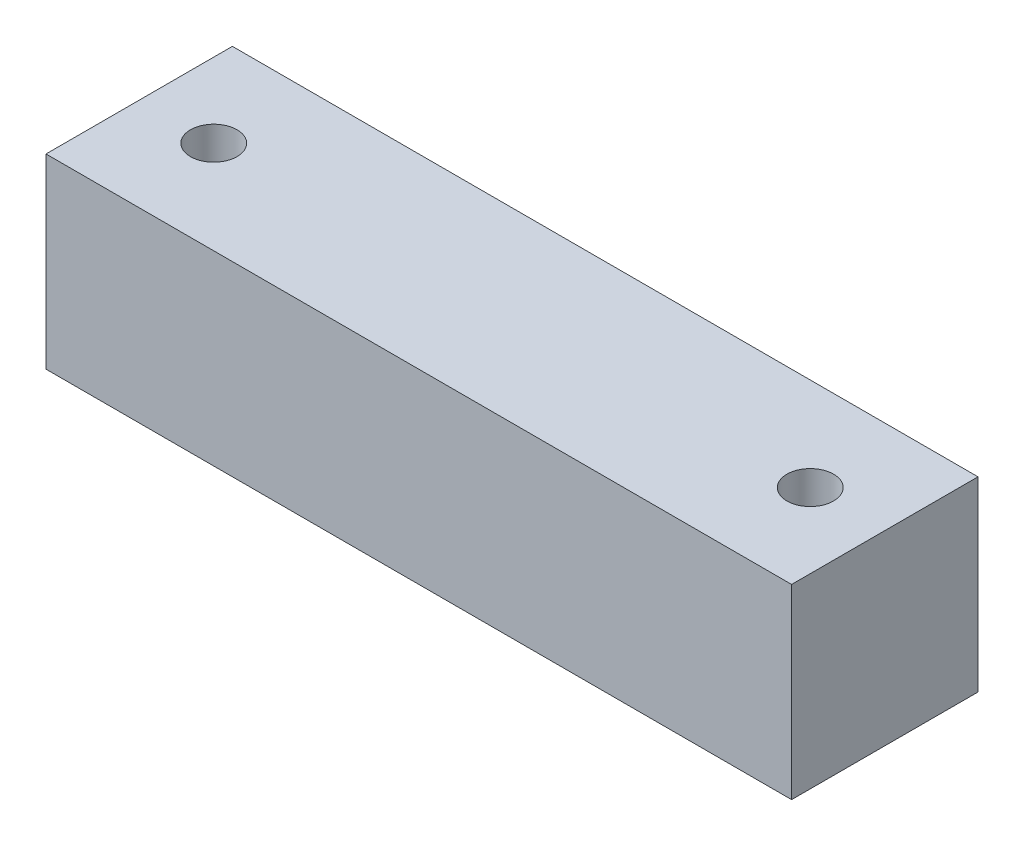
ISO-10303-21;
HEADER;
FILE_DESCRIPTION(('STEP AP214'),'2;1');
FILE_NAME('part.step','',(''),(''),'','','');
FILE_SCHEMA(('AUTOMOTIVE_DESIGN { 1 0 10303 214 1 1 1 1 }'));
ENDSEC;
DATA;
#1=APPLICATION_CONTEXT('core data for automotive mechanical design processes');
#2=APPLICATION_PROTOCOL_DEFINITION('international standard','automotive_design',2000,#1);
#3=PRODUCT_CONTEXT('',#1,'mechanical');
#4=PRODUCT('Part','Part','',(#3));
#5=PRODUCT_RELATED_PRODUCT_CATEGORY('part','',(#4));
#6=PRODUCT_DEFINITION_FORMATION('','',#4);
#7=PRODUCT_DEFINITION_CONTEXT('part definition',#1,'design');
#8=PRODUCT_DEFINITION('design','',#6,#7);
#9=PRODUCT_DEFINITION_SHAPE('','',#8);
#10=(LENGTH_UNIT() NAMED_UNIT(*) SI_UNIT(.MILLI.,.METRE.));
#11=(NAMED_UNIT(*) PLANE_ANGLE_UNIT() SI_UNIT($,.RADIAN.));
#12=(NAMED_UNIT(*) SI_UNIT($,.STERADIAN.) SOLID_ANGLE_UNIT());
#13=UNCERTAINTY_MEASURE_WITH_UNIT(LENGTH_MEASURE(1.E-05),#10,'distance_accuracy_value','');
#14=(GEOMETRIC_REPRESENTATION_CONTEXT(3) GLOBAL_UNCERTAINTY_ASSIGNED_CONTEXT((#13)) GLOBAL_UNIT_ASSIGNED_CONTEXT((#10,
#11,#12)) REPRESENTATION_CONTEXT('',''));
#15=CARTESIAN_POINT('',(0.,0.,0.));
#16=DIRECTION('',(0.,0.,1.));
#17=DIRECTION('',(1.,0.,0.));
#18=AXIS2_PLACEMENT_3D('',#15,#16,#17);
#19=CARTESIAN_POINT('',(-20.,-5.,10.));
#20=DIRECTION('',(0.,1.,0.));
#21=DIRECTION('',(0.,0.,1.));
#22=AXIS2_PLACEMENT_3D('',#19,#20,#21);
#23=PLANE('',#22);
#24=CARTESIAN_POINT('',(16.,-5.,5.00000000000001));
#25=DIRECTION('',(0.,-1.,0.));
#26=DIRECTION('',(0.,0.,-1.));
#27=AXIS2_PLACEMENT_3D('',#24,#25,#26);
#28=CIRCLE('',#27,1.25);
#29=CARTESIAN_POINT('',(16.,-5.,3.75));
#30=VERTEX_POINT('',#29);
#31=EDGE_CURVE('E113',#30,#30,#28,.T.);
#32=ORIENTED_EDGE('',*,*,#31,.F.);
#33=EDGE_LOOP('',(#32));
#34=FACE_BOUND('',#33,.T.);
#35=DIRECTION('',(1.,0.,0.));
#36=VECTOR('',#35,1.);
#37=CARTESIAN_POINT('',(-20.,-5.,0.));
#38=LINE('',#37,#36);
#39=CARTESIAN_POINT('',(-20.,-5.,0.));
#40=VERTEX_POINT('',#39);
#41=CARTESIAN_POINT('',(20.,-5.,0.));
#42=VERTEX_POINT('',#41);
#43=EDGE_CURVE('E73',#40,#42,#38,.T.);
#44=ORIENTED_EDGE('',*,*,#43,.T.);
#45=DIRECTION('',(0.,0.,-1.));
#46=VECTOR('',#45,1.);
#47=CARTESIAN_POINT('',(20.,-5.,10.));
#48=LINE('',#47,#46);
#49=CARTESIAN_POINT('',(20.,-5.,10.));
#50=VERTEX_POINT('',#49);
#51=EDGE_CURVE('E93',#50,#42,#48,.T.);
#52=ORIENTED_EDGE('',*,*,#51,.F.);
#53=DIRECTION('',(1.,0.,0.));
#54=VECTOR('',#53,1.);
#55=CARTESIAN_POINT('',(-20.,-5.,10.));
#56=LINE('',#55,#54);
#57=CARTESIAN_POINT('',(-20.,-5.,10.));
#58=VERTEX_POINT('',#57);
#59=EDGE_CURVE('E50',#58,#50,#56,.T.);
#60=ORIENTED_EDGE('',*,*,#59,.F.);
#61=DIRECTION('',(0.,0.,-1.));
#62=VECTOR('',#61,1.);
#63=CARTESIAN_POINT('',(-20.,-5.,10.));
#64=LINE('',#63,#62);
#65=EDGE_CURVE('E90',#58,#40,#64,.T.);
#66=ORIENTED_EDGE('',*,*,#65,.T.);
#67=EDGE_LOOP('',(#44,#52,#60,#66));
#68=FACE_BOUND('',#67,.T.);
#69=CARTESIAN_POINT('',(-16.,-5.,5.));
#70=DIRECTION('',(0.,-1.,0.));
#71=DIRECTION('',(0.,0.,-1.));
#72=AXIS2_PLACEMENT_3D('',#69,#70,#71);
#73=CIRCLE('',#72,1.25);
#74=CARTESIAN_POINT('',(-16.,-5.,3.75));
#75=VERTEX_POINT('',#74);
#76=EDGE_CURVE('E119',#75,#75,#73,.T.);
#77=ORIENTED_EDGE('',*,*,#76,.F.);
#78=EDGE_LOOP('',(#77));
#79=FACE_BOUND('',#78,.T.);
#80=ADVANCED_FACE('F33',(#34,#68,#79),#23,.F.);
#81=CARTESIAN_POINT('',(20.,5.,10.));
#82=DIRECTION('',(-1.,0.,0.));
#83=DIRECTION('',(0.,0.,1.));
#84=AXIS2_PLACEMENT_3D('',#81,#82,#83);
#85=PLANE('',#84);
#86=DIRECTION('',(0.,1.,0.));
#87=VECTOR('',#86,1.);
#88=CARTESIAN_POINT('',(20.,5.,0.));
#89=LINE('',#88,#87);
#90=CARTESIAN_POINT('',(20.,5.,0.));
#91=VERTEX_POINT('',#90);
#92=EDGE_CURVE('E97',#42,#91,#89,.T.);
#93=ORIENTED_EDGE('',*,*,#92,.T.);
#94=DIRECTION('',(0.,0.,-1.));
#95=VECTOR('',#94,1.);
#96=CARTESIAN_POINT('',(20.,5.,10.));
#97=LINE('',#96,#95);
#98=CARTESIAN_POINT('',(20.,5.,10.));
#99=VERTEX_POINT('',#98);
#100=EDGE_CURVE('E11',#99,#91,#97,.T.);
#101=ORIENTED_EDGE('',*,*,#100,.F.);
#102=DIRECTION('',(0.,1.,0.));
#103=VECTOR('',#102,1.);
#104=CARTESIAN_POINT('',(20.,5.,10.));
#105=LINE('',#104,#103);
#106=EDGE_CURVE('E85',#50,#99,#105,.T.);
#107=ORIENTED_EDGE('',*,*,#106,.F.);
#108=ORIENTED_EDGE('',*,*,#51,.T.);
#109=EDGE_LOOP('',(#93,#101,#107,#108));
#110=FACE_BOUND('',#109,.T.);
#111=ADVANCED_FACE('F35',(#110),#85,.F.);
#112=CARTESIAN_POINT('',(-20.,5.,10.));
#113=DIRECTION('',(0.,-1.,0.));
#114=DIRECTION('',(0.,0.,-1.));
#115=AXIS2_PLACEMENT_3D('',#112,#113,#114);
#116=PLANE('',#115);
#117=CARTESIAN_POINT('',(-16.,5.,5.));
#118=DIRECTION('',(0.,-1.,0.));
#119=DIRECTION('',(0.,0.,-1.));
#120=AXIS2_PLACEMENT_3D('',#117,#118,#119);
#121=CIRCLE('',#120,1.25);
#122=CARTESIAN_POINT('',(-16.,5.,3.75));
#123=VERTEX_POINT('',#122);
#124=EDGE_CURVE('E116',#123,#123,#121,.T.);
#125=ORIENTED_EDGE('',*,*,#124,.T.);
#126=EDGE_LOOP('',(#125));
#127=FACE_BOUND('',#126,.T.);
#128=CARTESIAN_POINT('',(16.,5.,5.00000000000001));
#129=DIRECTION('',(0.,-1.,0.));
#130=DIRECTION('',(0.,0.,-1.));
#131=AXIS2_PLACEMENT_3D('',#128,#129,#130);
#132=CIRCLE('',#131,1.25);
#133=CARTESIAN_POINT('',(16.,5.,3.75000000000001));
#134=VERTEX_POINT('',#133);
#135=EDGE_CURVE('E100',#134,#134,#132,.T.);
#136=ORIENTED_EDGE('',*,*,#135,.T.);
#137=EDGE_LOOP('',(#136));
#138=FACE_BOUND('',#137,.T.);
#139=DIRECTION('',(-1.,0.,0.));
#140=VECTOR('',#139,1.);
#141=CARTESIAN_POINT('',(-20.,5.,0.));
#142=LINE('',#141,#140);
#143=CARTESIAN_POINT('',(-20.,5.,0.));
#144=VERTEX_POINT('',#143);
#145=EDGE_CURVE('E89',#91,#144,#142,.T.);
#146=ORIENTED_EDGE('',*,*,#145,.T.);
#147=DIRECTION('',(0.,0.,-1.));
#148=VECTOR('',#147,1.);
#149=CARTESIAN_POINT('',(-20.,5.,10.));
#150=LINE('',#149,#148);
#151=CARTESIAN_POINT('',(-20.,5.,10.));
#152=VERTEX_POINT('',#151);
#153=EDGE_CURVE('E42',#152,#144,#150,.T.);
#154=ORIENTED_EDGE('',*,*,#153,.F.);
#155=DIRECTION('',(-1.,0.,0.));
#156=VECTOR('',#155,1.);
#157=CARTESIAN_POINT('',(-20.,5.,10.));
#158=LINE('',#157,#156);
#159=EDGE_CURVE('E80',#99,#152,#158,.T.);
#160=ORIENTED_EDGE('',*,*,#159,.F.);
#161=ORIENTED_EDGE('',*,*,#100,.T.);
#162=EDGE_LOOP('',(#146,#154,#160,#161));
#163=FACE_BOUND('',#162,.T.);
#164=ADVANCED_FACE('F88',(#127,#138,#163),#116,.F.);
#165=CARTESIAN_POINT('',(-20.,5.,10.));
#166=DIRECTION('',(1.,0.,0.));
#167=DIRECTION('',(0.,1.,0.));
#168=AXIS2_PLACEMENT_3D('',#165,#166,#167);
#169=PLANE('',#168);
#170=DIRECTION('',(0.,-1.,0.));
#171=VECTOR('',#170,1.);
#172=CARTESIAN_POINT('',(-20.,5.,0.));
#173=LINE('',#172,#171);
#174=EDGE_CURVE('E67',#144,#40,#173,.T.);
#175=ORIENTED_EDGE('',*,*,#174,.T.);
#176=ORIENTED_EDGE('',*,*,#65,.F.);
#177=DIRECTION('',(0.,-1.,0.));
#178=VECTOR('',#177,1.);
#179=CARTESIAN_POINT('',(-20.,5.,10.));
#180=LINE('',#179,#178);
#181=EDGE_CURVE('E83',#152,#58,#180,.T.);
#182=ORIENTED_EDGE('',*,*,#181,.F.);
#183=ORIENTED_EDGE('',*,*,#153,.T.);
#184=EDGE_LOOP('',(#175,#176,#182,#183));
#185=FACE_BOUND('',#184,.T.);
#186=ADVANCED_FACE('F91',(#185),#169,.F.);
#187=CARTESIAN_POINT('',(0.,0.,10.));
#188=DIRECTION('',(0.,0.,1.));
#189=DIRECTION('',(1.,0.,0.));
#190=AXIS2_PLACEMENT_3D('',#187,#188,#189);
#191=PLANE('',#190);
#192=ORIENTED_EDGE('',*,*,#106,.T.);
#193=ORIENTED_EDGE('',*,*,#159,.T.);
#194=ORIENTED_EDGE('',*,*,#181,.T.);
#195=ORIENTED_EDGE('',*,*,#59,.T.);
#196=EDGE_LOOP('',(#192,#193,#194,#195));
#197=FACE_BOUND('',#196,.T.);
#198=ADVANCED_FACE('F81',(#197),#191,.T.);
#199=CARTESIAN_POINT('',(0.,0.,0.));
#200=DIRECTION('',(0.,0.,1.));
#201=DIRECTION('',(1.,0.,0.));
#202=AXIS2_PLACEMENT_3D('',#199,#200,#201);
#203=PLANE('',#202);
#204=ORIENTED_EDGE('',*,*,#92,.F.);
#205=ORIENTED_EDGE('',*,*,#43,.F.);
#206=ORIENTED_EDGE('',*,*,#174,.F.);
#207=ORIENTED_EDGE('',*,*,#145,.F.);
#208=EDGE_LOOP('',(#204,#205,#206,#207));
#209=FACE_BOUND('',#208,.T.);
#210=ADVANCED_FACE('F108',(#209),#203,.F.);
#211=CARTESIAN_POINT('',(16.,-5.,5.00000000000001));
#212=DIRECTION('',(0.,-1.,0.));
#213=DIRECTION('',(0.,0.,-1.));
#214=AXIS2_PLACEMENT_3D('',#211,#212,#213);
#215=CYLINDRICAL_SURFACE('',#214,1.25);
#216=ORIENTED_EDGE('',*,*,#135,.F.);
#217=EDGE_LOOP('',(#216));
#218=FACE_BOUND('',#217,.T.);
#219=ORIENTED_EDGE('',*,*,#31,.T.);
#220=EDGE_LOOP('',(#219));
#221=FACE_BOUND('',#220,.T.);
#222=ADVANCED_FACE('F143',(#218,#221),#215,.F.);
#223=CARTESIAN_POINT('',(-16.,-5.,5.));
#224=DIRECTION('',(0.,-1.,0.));
#225=DIRECTION('',(0.,0.,-1.));
#226=AXIS2_PLACEMENT_3D('',#223,#224,#225);
#227=CYLINDRICAL_SURFACE('',#226,1.25);
#228=ORIENTED_EDGE('',*,*,#124,.F.);
#229=EDGE_LOOP('',(#228));
#230=FACE_BOUND('',#229,.T.);
#231=ORIENTED_EDGE('',*,*,#76,.T.);
#232=EDGE_LOOP('',(#231));
#233=FACE_BOUND('',#232,.T.);
#234=ADVANCED_FACE('F123',(#230,#233),#227,.F.);
#235=CLOSED_SHELL('',(#80,#111,#164,#186,#198,#210,#222,#234));
#236=MANIFOLD_SOLID_BREP('B2',#235);
#237=ADVANCED_BREP_SHAPE_REPRESENTATION('',(#18,#236),#14);
#238=SHAPE_DEFINITION_REPRESENTATION(#9,#237);
ENDSEC;
END-ISO-10303-21;
